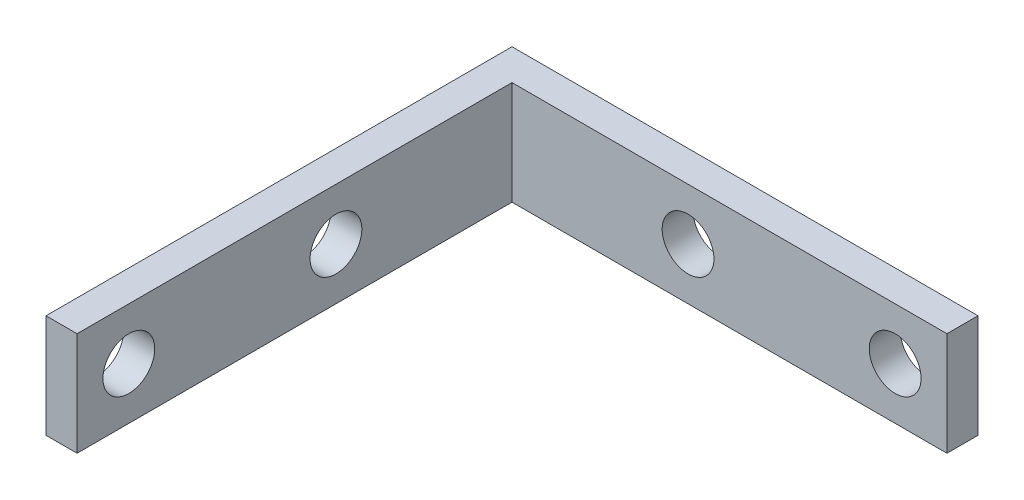
ISO-10303-21;
HEADER;
FILE_DESCRIPTION(('STEP AP214'),'2;1');
FILE_NAME('part.step','',(''),(''),'','','');
FILE_SCHEMA(('AUTOMOTIVE_DESIGN { 1 0 10303 214 1 1 1 1 }'));
ENDSEC;
DATA;
#1=APPLICATION_CONTEXT('core data for automotive mechanical design processes');
#2=APPLICATION_PROTOCOL_DEFINITION('international standard','automotive_design',2000,#1);
#3=PRODUCT_CONTEXT('',#1,'mechanical');
#4=PRODUCT('Part','Part','',(#3));
#5=PRODUCT_RELATED_PRODUCT_CATEGORY('part','',(#4));
#6=PRODUCT_DEFINITION_FORMATION('','',#4);
#7=PRODUCT_DEFINITION_CONTEXT('part definition',#1,'design');
#8=PRODUCT_DEFINITION('design','',#6,#7);
#9=PRODUCT_DEFINITION_SHAPE('','',#8);
#10=(LENGTH_UNIT() NAMED_UNIT(*) SI_UNIT(.MILLI.,.METRE.));
#11=(NAMED_UNIT(*) PLANE_ANGLE_UNIT() SI_UNIT($,.RADIAN.));
#12=(NAMED_UNIT(*) SI_UNIT($,.STERADIAN.) SOLID_ANGLE_UNIT());
#13=UNCERTAINTY_MEASURE_WITH_UNIT(LENGTH_MEASURE(1.E-05),#10,'distance_accuracy_value','');
#14=(GEOMETRIC_REPRESENTATION_CONTEXT(3) GLOBAL_UNCERTAINTY_ASSIGNED_CONTEXT((#13)) GLOBAL_UNIT_ASSIGNED_CONTEXT((#10,
#11,#12)) REPRESENTATION_CONTEXT('',''));
#15=CARTESIAN_POINT('',(0.,0.,0.));
#16=DIRECTION('',(0.,0.,1.));
#17=DIRECTION('',(1.,0.,0.));
#18=AXIS2_PLACEMENT_3D('',#15,#16,#17);
#19=CARTESIAN_POINT('',(0.,0.,3.));
#20=DIRECTION('',(0.,0.,-1.));
#21=DIRECTION('',(-1.,0.,0.));
#22=AXIS2_PLACEMENT_3D('',#19,#20,#21);
#23=PLANE('',#22);
#24=CARTESIAN_POINT('',(40.,5.,3.));
#25=DIRECTION('',(0.,0.,1.));
#26=DIRECTION('',(1.,0.,0.));
#27=AXIS2_PLACEMENT_3D('',#24,#25,#26);
#28=CIRCLE('',#27,2.49999999999999);
#29=CARTESIAN_POINT('',(42.5,5.,3.));
#30=VERTEX_POINT('',#29);
#31=EDGE_CURVE('E150',#30,#30,#28,.T.);
#32=ORIENTED_EDGE('',*,*,#31,.F.);
#33=EDGE_LOOP('',(#32));
#34=FACE_BOUND('',#33,.T.);
#35=CARTESIAN_POINT('',(20.,5.,3.));
#36=DIRECTION('',(0.,0.,1.));
#37=DIRECTION('',(1.,0.,0.));
#38=AXIS2_PLACEMENT_3D('',#35,#36,#37);
#39=CIRCLE('',#38,2.5);
#40=CARTESIAN_POINT('',(22.5,5.,3.));
#41=VERTEX_POINT('',#40);
#42=EDGE_CURVE('E100',#41,#41,#39,.T.);
#43=ORIENTED_EDGE('',*,*,#42,.F.);
#44=EDGE_LOOP('',(#43));
#45=FACE_BOUND('',#44,.T.);
#46=DIRECTION('',(0.,1.,0.));
#47=VECTOR('',#46,1.);
#48=CARTESIAN_POINT('',(3.,10.,3.));
#49=LINE('',#48,#47);
#50=CARTESIAN_POINT('',(3.,0.,3.));
#51=VERTEX_POINT('',#50);
#52=CARTESIAN_POINT('',(3.,10.,3.));
#53=VERTEX_POINT('',#52);
#54=EDGE_CURVE('E48',#51,#53,#49,.T.);
#55=ORIENTED_EDGE('',*,*,#54,.F.);
#56=DIRECTION('',(1.,0.,0.));
#57=VECTOR('',#56,1.);
#58=CARTESIAN_POINT('',(0.,0.,3.));
#59=LINE('',#58,#57);
#60=CARTESIAN_POINT('',(45.,0.,3.));
#61=VERTEX_POINT('',#60);
#62=EDGE_CURVE('E85',#51,#61,#59,.T.);
#63=ORIENTED_EDGE('',*,*,#62,.T.);
#64=DIRECTION('',(0.,1.,0.));
#65=VECTOR('',#64,1.);
#66=CARTESIAN_POINT('',(45.,0.,3.));
#67=LINE('',#66,#65);
#68=CARTESIAN_POINT('',(45.,10.,3.));
#69=VERTEX_POINT('',#68);
#70=EDGE_CURVE('E54',#61,#69,#67,.T.);
#71=ORIENTED_EDGE('',*,*,#70,.T.);
#72=DIRECTION('',(-1.,0.,0.));
#73=VECTOR('',#72,1.);
#74=CARTESIAN_POINT('',(0.,10.,3.));
#75=LINE('',#74,#73);
#76=EDGE_CURVE('E95',#69,#53,#75,.T.);
#77=ORIENTED_EDGE('',*,*,#76,.T.);
#78=EDGE_LOOP('',(#55,#63,#71,#77));
#79=FACE_BOUND('',#78,.T.);
#80=ADVANCED_FACE('F33',(#34,#45,#79),#23,.F.);
#81=CARTESIAN_POINT('',(0.,0.,0.));
#82=DIRECTION('',(0.,0.,-1.));
#83=DIRECTION('',(-1.,0.,0.));
#84=AXIS2_PLACEMENT_3D('',#81,#82,#83);
#85=PLANE('',#84);
#86=CARTESIAN_POINT('',(20.,5.,0.));
#87=DIRECTION('',(0.,0.,1.));
#88=DIRECTION('',(1.,0.,0.));
#89=AXIS2_PLACEMENT_3D('',#86,#87,#88);
#90=CIRCLE('',#89,2.5);
#91=CARTESIAN_POINT('',(22.5,5.,0.));
#92=VERTEX_POINT('',#91);
#93=EDGE_CURVE('E104',#92,#92,#90,.T.);
#94=ORIENTED_EDGE('',*,*,#93,.T.);
#95=EDGE_LOOP('',(#94));
#96=FACE_BOUND('',#95,.T.);
#97=DIRECTION('',(0.,-1.,0.));
#98=VECTOR('',#97,1.);
#99=CARTESIAN_POINT('',(0.,0.,0.));
#100=LINE('',#99,#98);
#101=CARTESIAN_POINT('',(0.,10.,0.));
#102=VERTEX_POINT('',#101);
#103=CARTESIAN_POINT('',(0.,0.,0.));
#104=VERTEX_POINT('',#103);
#105=EDGE_CURVE('E92',#102,#104,#100,.T.);
#106=ORIENTED_EDGE('',*,*,#105,.F.);
#107=DIRECTION('',(-1.,0.,0.));
#108=VECTOR('',#107,1.);
#109=CARTESIAN_POINT('',(0.,10.,0.));
#110=LINE('',#109,#108);
#111=CARTESIAN_POINT('',(45.,10.,0.));
#112=VERTEX_POINT('',#111);
#113=EDGE_CURVE('E74',#112,#102,#110,.T.);
#114=ORIENTED_EDGE('',*,*,#113,.F.);
#115=DIRECTION('',(0.,1.,0.));
#116=VECTOR('',#115,1.);
#117=CARTESIAN_POINT('',(45.,0.,0.));
#118=LINE('',#117,#116);
#119=CARTESIAN_POINT('',(45.,0.,0.));
#120=VERTEX_POINT('',#119);
#121=EDGE_CURVE('E86',#120,#112,#118,.T.);
#122=ORIENTED_EDGE('',*,*,#121,.F.);
#123=DIRECTION('',(1.,0.,0.));
#124=VECTOR('',#123,1.);
#125=CARTESIAN_POINT('',(0.,0.,0.));
#126=LINE('',#125,#124);
#127=EDGE_CURVE('E99',#104,#120,#126,.T.);
#128=ORIENTED_EDGE('',*,*,#127,.F.);
#129=EDGE_LOOP('',(#106,#114,#122,#128));
#130=FACE_BOUND('',#129,.T.);
#131=CARTESIAN_POINT('',(40.,5.,0.));
#132=DIRECTION('',(0.,0.,1.));
#133=DIRECTION('',(1.,0.,0.));
#134=AXIS2_PLACEMENT_3D('',#131,#132,#133);
#135=CIRCLE('',#134,2.49999999999999);
#136=CARTESIAN_POINT('',(42.5,5.,0.));
#137=VERTEX_POINT('',#136);
#138=EDGE_CURVE('E149',#137,#137,#135,.T.);
#139=ORIENTED_EDGE('',*,*,#138,.T.);
#140=EDGE_LOOP('',(#139));
#141=FACE_BOUND('',#140,.T.);
#142=ADVANCED_FACE('F97',(#96,#130,#141),#85,.T.);
#143=CARTESIAN_POINT('',(0.,0.,3.));
#144=DIRECTION('',(1.,0.,0.));
#145=DIRECTION('',(0.,0.,-1.));
#146=AXIS2_PLACEMENT_3D('',#143,#144,#145);
#147=PLANE('',#146);
#148=CARTESIAN_POINT('',(0.,4.99999999999999,20.));
#149=DIRECTION('',(1.,0.,0.));
#150=DIRECTION('',(0.,1.,0.));
#151=AXIS2_PLACEMENT_3D('',#148,#149,#150);
#152=CIRCLE('',#151,2.5);
#153=CARTESIAN_POINT('',(0.,7.49999999999999,20.));
#154=VERTEX_POINT('',#153);
#155=EDGE_CURVE('E146',#154,#154,#152,.T.);
#156=ORIENTED_EDGE('',*,*,#155,.T.);
#157=EDGE_LOOP('',(#156));
#158=FACE_BOUND('',#157,.T.);
#159=CARTESIAN_POINT('',(0.,4.99999999999999,40.));
#160=DIRECTION('',(1.,0.,0.));
#161=DIRECTION('',(0.,1.,0.));
#162=AXIS2_PLACEMENT_3D('',#159,#160,#161);
#163=CIRCLE('',#162,2.5);
#164=CARTESIAN_POINT('',(0.,7.49999999999999,40.));
#165=VERTEX_POINT('',#164);
#166=EDGE_CURVE('E186',#165,#165,#163,.T.);
#167=ORIENTED_EDGE('',*,*,#166,.T.);
#168=EDGE_LOOP('',(#167));
#169=FACE_BOUND('',#168,.T.);
#170=ORIENTED_EDGE('',*,*,#105,.T.);
#171=DIRECTION('',(0.,0.,-1.));
#172=VECTOR('',#171,1.);
#173=CARTESIAN_POINT('',(0.,0.,3.));
#174=LINE('',#173,#172);
#175=CARTESIAN_POINT('',(0.,0.,45.));
#176=VERTEX_POINT('',#175);
#177=EDGE_CURVE('E11',#176,#104,#174,.T.);
#178=ORIENTED_EDGE('',*,*,#177,.F.);
#179=DIRECTION('',(0.,-1.,0.));
#180=VECTOR('',#179,1.);
#181=CARTESIAN_POINT('',(0.,10.,45.));
#182=LINE('',#181,#180);
#183=CARTESIAN_POINT('',(0.,10.,45.));
#184=VERTEX_POINT('',#183);
#185=EDGE_CURVE('E94',#184,#176,#182,.T.);
#186=ORIENTED_EDGE('',*,*,#185,.F.);
#187=DIRECTION('',(0.,0.,-1.));
#188=VECTOR('',#187,1.);
#189=CARTESIAN_POINT('',(0.,10.,3.));
#190=LINE('',#189,#188);
#191=EDGE_CURVE('E78',#184,#102,#190,.T.);
#192=ORIENTED_EDGE('',*,*,#191,.T.);
#193=EDGE_LOOP('',(#170,#178,#186,#192));
#194=FACE_BOUND('',#193,.T.);
#195=ADVANCED_FACE('F35',(#158,#169,#194),#147,.F.);
#196=CARTESIAN_POINT('',(0.,0.,3.));
#197=DIRECTION('',(0.,1.,0.));
#198=DIRECTION('',(0.,0.,1.));
#199=AXIS2_PLACEMENT_3D('',#196,#197,#198);
#200=PLANE('',#199);
#201=ORIENTED_EDGE('',*,*,#127,.T.);
#202=DIRECTION('',(0.,0.,-1.));
#203=VECTOR('',#202,1.);
#204=CARTESIAN_POINT('',(45.,0.,3.));
#205=LINE('',#204,#203);
#206=EDGE_CURVE('E41',#61,#120,#205,.T.);
#207=ORIENTED_EDGE('',*,*,#206,.F.);
#208=ORIENTED_EDGE('',*,*,#62,.F.);
#209=DIRECTION('',(0.,0.,-1.));
#210=VECTOR('',#209,1.);
#211=CARTESIAN_POINT('',(3.,0.,45.));
#212=LINE('',#211,#210);
#213=CARTESIAN_POINT('',(3.,0.,45.));
#214=VERTEX_POINT('',#213);
#215=EDGE_CURVE('E141',#214,#51,#212,.T.);
#216=ORIENTED_EDGE('',*,*,#215,.F.);
#217=DIRECTION('',(1.,0.,0.));
#218=VECTOR('',#217,1.);
#219=CARTESIAN_POINT('',(0.,0.,45.));
#220=LINE('',#219,#218);
#221=EDGE_CURVE('E121',#176,#214,#220,.T.);
#222=ORIENTED_EDGE('',*,*,#221,.F.);
#223=ORIENTED_EDGE('',*,*,#177,.T.);
#224=EDGE_LOOP('',(#201,#207,#208,#216,#222,#223));
#225=FACE_BOUND('',#224,.T.);
#226=ADVANCED_FACE('F115',(#225),#200,.F.);
#227=CARTESIAN_POINT('',(45.,0.,3.));
#228=DIRECTION('',(-1.,0.,0.));
#229=DIRECTION('',(0.,0.,1.));
#230=AXIS2_PLACEMENT_3D('',#227,#228,#229);
#231=PLANE('',#230);
#232=ORIENTED_EDGE('',*,*,#121,.T.);
#233=DIRECTION('',(0.,0.,-1.));
#234=VECTOR('',#233,1.);
#235=CARTESIAN_POINT('',(45.,10.,3.));
#236=LINE('',#235,#234);
#237=EDGE_CURVE('E81',#69,#112,#236,.T.);
#238=ORIENTED_EDGE('',*,*,#237,.F.);
#239=ORIENTED_EDGE('',*,*,#70,.F.);
#240=ORIENTED_EDGE('',*,*,#206,.T.);
#241=EDGE_LOOP('',(#232,#238,#239,#240));
#242=FACE_BOUND('',#241,.T.);
#243=ADVANCED_FACE('F113',(#242),#231,.F.);
#244=CARTESIAN_POINT('',(0.,10.,3.));
#245=DIRECTION('',(0.,-1.,0.));
#246=DIRECTION('',(0.,0.,-1.));
#247=AXIS2_PLACEMENT_3D('',#244,#245,#246);
#248=PLANE('',#247);
#249=ORIENTED_EDGE('',*,*,#113,.T.);
#250=ORIENTED_EDGE('',*,*,#191,.F.);
#251=DIRECTION('',(-1.,0.,0.));
#252=VECTOR('',#251,1.);
#253=CARTESIAN_POINT('',(0.,10.,45.));
#254=LINE('',#253,#252);
#255=CARTESIAN_POINT('',(3.,10.,45.));
#256=VERTEX_POINT('',#255);
#257=EDGE_CURVE('E135',#256,#184,#254,.T.);
#258=ORIENTED_EDGE('',*,*,#257,.F.);
#259=DIRECTION('',(0.,0.,-1.));
#260=VECTOR('',#259,1.);
#261=CARTESIAN_POINT('',(3.,10.,45.));
#262=LINE('',#261,#260);
#263=EDGE_CURVE('E139',#256,#53,#262,.T.);
#264=ORIENTED_EDGE('',*,*,#263,.T.);
#265=ORIENTED_EDGE('',*,*,#76,.F.);
#266=ORIENTED_EDGE('',*,*,#237,.T.);
#267=EDGE_LOOP('',(#249,#250,#258,#264,#265,#266));
#268=FACE_BOUND('',#267,.T.);
#269=ADVANCED_FACE('F76',(#268),#248,.F.);
#270=CARTESIAN_POINT('',(20.,5.,3.));
#271=DIRECTION('',(0.,0.,-1.));
#272=DIRECTION('',(-1.,0.,0.));
#273=AXIS2_PLACEMENT_3D('',#270,#271,#272);
#274=CYLINDRICAL_SURFACE('',#273,2.5);
#275=ORIENTED_EDGE('',*,*,#42,.T.);
#276=EDGE_LOOP('',(#275));
#277=FACE_BOUND('',#276,.T.);
#278=ORIENTED_EDGE('',*,*,#93,.F.);
#279=EDGE_LOOP('',(#278));
#280=FACE_BOUND('',#279,.T.);
#281=ADVANCED_FACE('F168',(#277,#280),#274,.F.);
#282=CARTESIAN_POINT('',(40.,5.,3.));
#283=DIRECTION('',(0.,0.,-1.));
#284=DIRECTION('',(-1.,0.,0.));
#285=AXIS2_PLACEMENT_3D('',#282,#283,#284);
#286=CYLINDRICAL_SURFACE('',#285,2.49999999999999);
#287=ORIENTED_EDGE('',*,*,#31,.T.);
#288=EDGE_LOOP('',(#287));
#289=FACE_BOUND('',#288,.T.);
#290=ORIENTED_EDGE('',*,*,#138,.F.);
#291=EDGE_LOOP('',(#290));
#292=FACE_BOUND('',#291,.T.);
#293=ADVANCED_FACE('F202',(#289,#292),#286,.F.);
#294=CARTESIAN_POINT('',(3.,10.,45.));
#295=DIRECTION('',(-1.,0.,0.));
#296=DIRECTION('',(0.,-1.,0.));
#297=AXIS2_PLACEMENT_3D('',#294,#295,#296);
#298=PLANE('',#297);
#299=CARTESIAN_POINT('',(3.,4.99999999999999,20.));
#300=DIRECTION('',(1.,0.,0.));
#301=DIRECTION('',(0.,1.,0.));
#302=AXIS2_PLACEMENT_3D('',#299,#300,#301);
#303=CIRCLE('',#302,2.5);
#304=CARTESIAN_POINT('',(3.,7.49999999999999,20.));
#305=VERTEX_POINT('',#304);
#306=EDGE_CURVE('E188',#305,#305,#303,.T.);
#307=ORIENTED_EDGE('',*,*,#306,.F.);
#308=EDGE_LOOP('',(#307));
#309=FACE_BOUND('',#308,.T.);
#310=CARTESIAN_POINT('',(3.,4.99999999999999,40.));
#311=DIRECTION('',(1.,0.,0.));
#312=DIRECTION('',(0.,1.,0.));
#313=AXIS2_PLACEMENT_3D('',#310,#311,#312);
#314=CIRCLE('',#313,2.5);
#315=CARTESIAN_POINT('',(3.,7.49999999999999,40.));
#316=VERTEX_POINT('',#315);
#317=EDGE_CURVE('E189',#316,#316,#314,.T.);
#318=ORIENTED_EDGE('',*,*,#317,.F.);
#319=EDGE_LOOP('',(#318));
#320=FACE_BOUND('',#319,.T.);
#321=ORIENTED_EDGE('',*,*,#54,.T.);
#322=ORIENTED_EDGE('',*,*,#263,.F.);
#323=DIRECTION('',(0.,1.,0.));
#324=VECTOR('',#323,1.);
#325=CARTESIAN_POINT('',(3.,10.,45.));
#326=LINE('',#325,#324);
#327=EDGE_CURVE('E132',#214,#256,#326,.T.);
#328=ORIENTED_EDGE('',*,*,#327,.F.);
#329=ORIENTED_EDGE('',*,*,#215,.T.);
#330=EDGE_LOOP('',(#321,#322,#328,#329));
#331=FACE_BOUND('',#330,.T.);
#332=ADVANCED_FACE('F140',(#309,#320,#331),#298,.F.);
#333=CARTESIAN_POINT('',(0.,0.,45.));
#334=DIRECTION('',(0.,0.,1.));
#335=DIRECTION('',(1.,0.,0.));
#336=AXIS2_PLACEMENT_3D('',#333,#334,#335);
#337=PLANE('',#336);
#338=ORIENTED_EDGE('',*,*,#185,.T.);
#339=ORIENTED_EDGE('',*,*,#221,.T.);
#340=ORIENTED_EDGE('',*,*,#327,.T.);
#341=ORIENTED_EDGE('',*,*,#257,.T.);
#342=EDGE_LOOP('',(#338,#339,#340,#341));
#343=FACE_BOUND('',#342,.T.);
#344=ADVANCED_FACE('F134',(#343),#337,.T.);
#345=CARTESIAN_POINT('',(0.,4.99999999999999,40.));
#346=DIRECTION('',(1.,0.,0.));
#347=DIRECTION('',(0.,1.,0.));
#348=AXIS2_PLACEMENT_3D('',#345,#346,#347);
#349=CYLINDRICAL_SURFACE('',#348,2.5);
#350=ORIENTED_EDGE('',*,*,#166,.F.);
#351=EDGE_LOOP('',(#350));
#352=FACE_BOUND('',#351,.T.);
#353=ORIENTED_EDGE('',*,*,#317,.T.);
#354=EDGE_LOOP('',(#353));
#355=FACE_BOUND('',#354,.T.);
#356=ADVANCED_FACE('F199',(#352,#355),#349,.F.);
#357=CARTESIAN_POINT('',(0.,4.99999999999999,20.));
#358=DIRECTION('',(1.,0.,0.));
#359=DIRECTION('',(0.,1.,0.));
#360=AXIS2_PLACEMENT_3D('',#357,#358,#359);
#361=CYLINDRICAL_SURFACE('',#360,2.5);
#362=ORIENTED_EDGE('',*,*,#155,.F.);
#363=EDGE_LOOP('',(#362));
#364=FACE_BOUND('',#363,.T.);
#365=ORIENTED_EDGE('',*,*,#306,.T.);
#366=EDGE_LOOP('',(#365));
#367=FACE_BOUND('',#366,.T.);
#368=ADVANCED_FACE('F215',(#364,#367),#361,.F.);
#369=CLOSED_SHELL('',(#80,#142,#195,#226,#243,#269,#281,#293,#332,#344,#356,#368));
#370=MANIFOLD_SOLID_BREP('B2',#369);
#371=ADVANCED_BREP_SHAPE_REPRESENTATION('',(#18,#370),#14);
#372=SHAPE_DEFINITION_REPRESENTATION(#9,#371);
ENDSEC;
END-ISO-10303-21;
